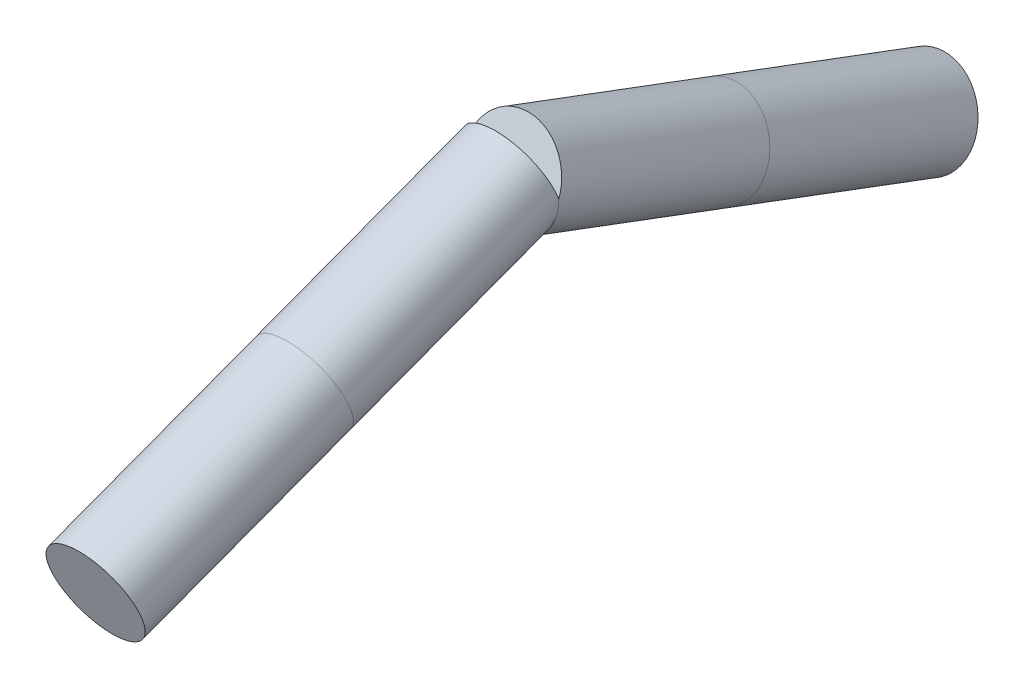
ISO-10303-21;
HEADER;
FILE_DESCRIPTION(('STEP AP214'),'2;1');
FILE_NAME('part.step','',(''),(''),'','','');
FILE_SCHEMA(('AUTOMOTIVE_DESIGN { 1 0 10303 214 1 1 1 1 }'));
ENDSEC;
DATA;
#1=APPLICATION_CONTEXT('core data for automotive mechanical design processes');
#2=APPLICATION_PROTOCOL_DEFINITION('international standard','automotive_design',2000,#1);
#3=PRODUCT_CONTEXT('',#1,'mechanical');
#4=PRODUCT('Part','Part','',(#3));
#5=PRODUCT_RELATED_PRODUCT_CATEGORY('part','',(#4));
#6=PRODUCT_DEFINITION_FORMATION('','',#4);
#7=PRODUCT_DEFINITION_CONTEXT('part definition',#1,'design');
#8=PRODUCT_DEFINITION('design','',#6,#7);
#9=PRODUCT_DEFINITION_SHAPE('','',#8);
#10=(LENGTH_UNIT() NAMED_UNIT(*) SI_UNIT(.MILLI.,.METRE.));
#11=(NAMED_UNIT(*) PLANE_ANGLE_UNIT() SI_UNIT($,.RADIAN.));
#12=(NAMED_UNIT(*) SI_UNIT($,.STERADIAN.) SOLID_ANGLE_UNIT());
#13=UNCERTAINTY_MEASURE_WITH_UNIT(LENGTH_MEASURE(1.E-05),#10,'distance_accuracy_value','');
#14=(GEOMETRIC_REPRESENTATION_CONTEXT(3) GLOBAL_UNCERTAINTY_ASSIGNED_CONTEXT((#13)) GLOBAL_UNIT_ASSIGNED_CONTEXT((#10,
#11,#12)) REPRESENTATION_CONTEXT('',''));
#15=CARTESIAN_POINT('',(0.,0.,0.));
#16=DIRECTION('',(0.,0.,1.));
#17=DIRECTION('',(1.,0.,0.));
#18=AXIS2_PLACEMENT_3D('',#15,#16,#17);
#19=CARTESIAN_POINT('',(0.,0.,0.));
#20=DIRECTION('',(0.,0.351123441588063,0.936329177569168));
#21=DIRECTION('',(1.,0.,0.));
#22=AXIS2_PLACEMENT_3D('',#19,#20,#21);
#23=PLANE('',#22);
#24=CARTESIAN_POINT('',(0.,0.,0.));
#25=DIRECTION('',(0.,0.351123441588063,0.936329177569168));
#26=DIRECTION('',(1.,0.,0.));
#27=AXIS2_PLACEMENT_3D('',#24,#25,#26);
#28=CIRCLE('',#27,18.);
#29=CARTESIAN_POINT('',(18.,0.,0.));
#30=VERTEX_POINT('',#29);
#31=EDGE_CURVE('E10',#30,#30,#28,.T.);
#32=ORIENTED_EDGE('',*,*,#31,.F.);
#33=EDGE_LOOP('',(#32));
#34=FACE_BOUND('',#33,.T.);
#35=ADVANCED_FACE('F16',(#34),#23,.F.);
#36=CARTESIAN_POINT('',(0.,0.,0.));
#37=DIRECTION('',(0.,0.351123441588063,0.936329177569168));
#38=DIRECTION('',(1.,0.,0.));
#39=AXIS2_PLACEMENT_3D('',#36,#37,#38);
#40=CYLINDRICAL_SURFACE('',#39,18.);
#41=CARTESIAN_POINT('',(0.,30.,80.));
#42=DIRECTION('',(0.,0.351123441588063,0.936329177569168));
#43=DIRECTION('',(1.,0.,0.));
#44=AXIS2_PLACEMENT_3D('',#41,#42,#43);
#45=CIRCLE('',#44,18.);
#46=CARTESIAN_POINT('',(18.,30.,80.));
#47=VERTEX_POINT('',#46);
#48=EDGE_CURVE('E67',#47,#47,#45,.T.);
#49=ORIENTED_EDGE('',*,*,#48,.F.);
#50=DIRECTION('',(0.,0.351123441588063,0.936329177569168));
#51=VECTOR('',#50,1.);
#52=CARTESIAN_POINT('',(18.,0.,0.));
#53=LINE('',#52,#51);
#54=EDGE_CURVE('E24',#30,#47,#53,.T.);
#55=ORIENTED_EDGE('',*,*,#54,.F.);
#56=ORIENTED_EDGE('',*,*,#31,.T.);
#57=ORIENTED_EDGE('',*,*,#54,.T.);
#58=EDGE_LOOP('',(#49,#55,#56,#57));
#59=FACE_BOUND('',#58,.T.);
#60=ADVANCED_FACE('F125',(#59),#40,.T.);
#61=CARTESIAN_POINT('',(0.,60.,160.));
#62=DIRECTION('',(0.,0.351123441588063,0.936329177569168));
#63=DIRECTION('',(1.,0.,0.));
#64=AXIS2_PLACEMENT_3D('',#61,#62,#63);
#65=PLANE('',#64);
#66=DIRECTION('',(1.,0.,0.));
#67=VECTOR('',#66,1.);
#68=CARTESIAN_POINT('',(0.,60.,160.));
#69=LINE('',#68,#67);
#70=CARTESIAN_POINT('',(-18.,60.,160.));
#71=VERTEX_POINT('',#70);
#72=CARTESIAN_POINT('',(18.,60.,160.));
#73=VERTEX_POINT('',#72);
#74=EDGE_CURVE('E58',#71,#73,#69,.T.);
#75=ORIENTED_EDGE('',*,*,#74,.T.);
#76=CARTESIAN_POINT('',(0.,60.,160.));
#77=DIRECTION('',(0.,0.351123441588063,0.936329177569168));
#78=DIRECTION('',(1.,0.,0.));
#79=AXIS2_PLACEMENT_3D('',#76,#77,#78);
#80=CIRCLE('',#79,18.);
#81=EDGE_CURVE('E70',#73,#71,#80,.T.);
#82=ORIENTED_EDGE('',*,*,#81,.T.);
#83=EDGE_LOOP('',(#75,#82));
#84=FACE_BOUND('',#83,.T.);
#85=ADVANCED_FACE('F71',(#84),#65,.T.);
#86=CARTESIAN_POINT('',(0.,60.,160.));
#87=DIRECTION('',(0.,-0.351123441588063,0.936329177569168));
#88=DIRECTION('',(-1.,0.,0.));
#89=AXIS2_PLACEMENT_3D('',#86,#87,#88);
#90=PLANE('',#89);
#91=CARTESIAN_POINT('',(0.,60.,160.));
#92=DIRECTION('',(0.,-0.351123441588063,0.936329177569168));
#93=DIRECTION('',(1.,0.,0.));
#94=AXIS2_PLACEMENT_3D('',#91,#92,#93);
#95=CIRCLE('',#94,18.);
#96=EDGE_CURVE('E62',#73,#71,#95,.T.);
#97=ORIENTED_EDGE('',*,*,#96,.F.);
#98=ORIENTED_EDGE('',*,*,#74,.F.);
#99=EDGE_LOOP('',(#97,#98));
#100=FACE_BOUND('',#99,.T.);
#101=ADVANCED_FACE('F60',(#100),#90,.F.);
#102=CARTESIAN_POINT('',(0.,30.,80.));
#103=DIRECTION('',(0.,0.351123441588063,0.936329177569168));
#104=DIRECTION('',(1.,0.,0.));
#105=AXIS2_PLACEMENT_3D('',#102,#103,#104);
#106=CYLINDRICAL_SURFACE('',#105,18.);
#107=ORIENTED_EDGE('',*,*,#81,.F.);
#108=DIRECTION('',(0.,0.351123441588063,0.936329177569168));
#109=VECTOR('',#108,1.);
#110=CARTESIAN_POINT('',(18.,30.,80.));
#111=LINE('',#110,#109);
#112=EDGE_CURVE('E76',#47,#73,#111,.T.);
#113=ORIENTED_EDGE('',*,*,#112,.F.);
#114=ORIENTED_EDGE('',*,*,#48,.T.);
#115=ORIENTED_EDGE('',*,*,#112,.T.);
#116=CARTESIAN_POINT('',(0.,60.,160.));
#117=DIRECTION('',(0.,0.,1.));
#118=DIRECTION('',(0.,1.,0.));
#119=AXIS2_PLACEMENT_3D('',#116,#117,#118);
#120=ELLIPSE('',#119,19.224008426964,18.);
#121=EDGE_CURVE('E81',#71,#73,#120,.T.);
#122=ORIENTED_EDGE('',*,*,#121,.F.);
#123=EDGE_LOOP('',(#107,#113,#114,#115,#122));
#124=FACE_BOUND('',#123,.T.);
#125=ADVANCED_FACE('F86',(#124),#106,.T.);
#126=CARTESIAN_POINT('',(0.,60.,160.));
#127=DIRECTION('',(0.,-0.351123441588063,0.936329177569168));
#128=DIRECTION('',(1.,0.,0.));
#129=AXIS2_PLACEMENT_3D('',#126,#127,#128);
#130=CYLINDRICAL_SURFACE('',#129,18.);
#131=ORIENTED_EDGE('',*,*,#121,.T.);
#132=DIRECTION('',(0.,-0.351123441588063,0.936329177569168));
#133=VECTOR('',#132,1.);
#134=CARTESIAN_POINT('',(18.,60.,160.));
#135=LINE('',#134,#133);
#136=CARTESIAN_POINT('',(18.,30.,240.));
#137=VERTEX_POINT('',#136);
#138=EDGE_CURVE('E83',#73,#137,#135,.T.);
#139=ORIENTED_EDGE('',*,*,#138,.T.);
#140=CARTESIAN_POINT('',(0.,30.,240.));
#141=DIRECTION('',(0.,-0.351123441588063,0.936329177569168));
#142=DIRECTION('',(1.,0.,0.));
#143=AXIS2_PLACEMENT_3D('',#140,#141,#142);
#144=CIRCLE('',#143,18.);
#145=EDGE_CURVE('E88',#137,#137,#144,.T.);
#146=ORIENTED_EDGE('',*,*,#145,.F.);
#147=ORIENTED_EDGE('',*,*,#138,.F.);
#148=ORIENTED_EDGE('',*,*,#96,.T.);
#149=EDGE_LOOP('',(#131,#139,#146,#147,#148));
#150=FACE_BOUND('',#149,.T.);
#151=ADVANCED_FACE('F80',(#150),#130,.T.);
#152=CARTESIAN_POINT('',(0.,0.,320.));
#153=DIRECTION('',(0.,-0.351123441588063,0.936329177569168));
#154=DIRECTION('',(-1.,0.,0.));
#155=AXIS2_PLACEMENT_3D('',#152,#153,#154);
#156=PLANE('',#155);
#157=CARTESIAN_POINT('',(0.,0.,320.));
#158=DIRECTION('',(0.,-0.351123441588063,0.936329177569168));
#159=DIRECTION('',(1.,0.,0.));
#160=AXIS2_PLACEMENT_3D('',#157,#158,#159);
#161=CIRCLE('',#160,18.);
#162=CARTESIAN_POINT('',(18.,0.,320.));
#163=VERTEX_POINT('',#162);
#164=EDGE_CURVE('E106',#163,#163,#161,.T.);
#165=ORIENTED_EDGE('',*,*,#164,.T.);
#166=EDGE_LOOP('',(#165));
#167=FACE_BOUND('',#166,.T.);
#168=ADVANCED_FACE('F113',(#167),#156,.T.);
#169=CARTESIAN_POINT('',(0.,30.,240.));
#170=DIRECTION('',(0.,-0.351123441588063,0.936329177569168));
#171=DIRECTION('',(1.,0.,0.));
#172=AXIS2_PLACEMENT_3D('',#169,#170,#171);
#173=CYLINDRICAL_SURFACE('',#172,18.);
#174=ORIENTED_EDGE('',*,*,#164,.F.);
#175=DIRECTION('',(0.,-0.351123441588063,0.936329177569168));
#176=VECTOR('',#175,1.);
#177=CARTESIAN_POINT('',(18.,30.,240.));
#178=LINE('',#177,#176);
#179=EDGE_CURVE('E96',#137,#163,#178,.T.);
#180=ORIENTED_EDGE('',*,*,#179,.F.);
#181=ORIENTED_EDGE('',*,*,#145,.T.);
#182=ORIENTED_EDGE('',*,*,#179,.T.);
#183=EDGE_LOOP('',(#174,#180,#181,#182));
#184=FACE_BOUND('',#183,.T.);
#185=ADVANCED_FACE('F116',(#184),#173,.T.);
#186=CLOSED_SHELL('',(#35,#60,#85,#101,#125,#151,#168,#185));
#187=MANIFOLD_SOLID_BREP('B1',#186);
#188=ADVANCED_BREP_SHAPE_REPRESENTATION('',(#18,#187),#14);
#189=SHAPE_DEFINITION_REPRESENTATION(#9,#188);
ENDSEC;
END-ISO-10303-21;
